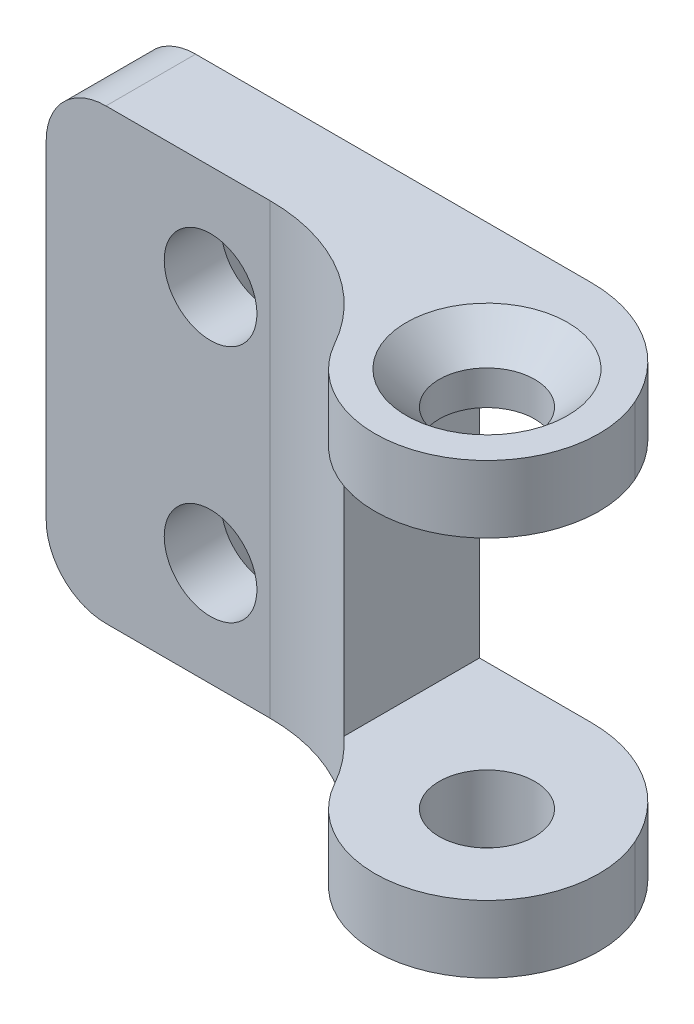
ISO-10303-21;
HEADER;
FILE_DESCRIPTION(('STEP AP214'),'2;1');
FILE_NAME('part.step','',(''),(''),'','','');
FILE_SCHEMA(('AUTOMOTIVE_DESIGN { 1 0 10303 214 1 1 1 1 }'));
ENDSEC;
DATA;
#1=APPLICATION_CONTEXT('core data for automotive mechanical design processes');
#2=APPLICATION_PROTOCOL_DEFINITION('international standard','automotive_design',2000,#1);
#3=PRODUCT_CONTEXT('',#1,'mechanical');
#4=PRODUCT('Part','Part','',(#3));
#5=PRODUCT_RELATED_PRODUCT_CATEGORY('part','',(#4));
#6=PRODUCT_DEFINITION_FORMATION('','',#4);
#7=PRODUCT_DEFINITION_CONTEXT('part definition',#1,'design');
#8=PRODUCT_DEFINITION('design','',#6,#7);
#9=PRODUCT_DEFINITION_SHAPE('','',#8);
#10=(LENGTH_UNIT() NAMED_UNIT(*) SI_UNIT(.MILLI.,.METRE.));
#11=(NAMED_UNIT(*) PLANE_ANGLE_UNIT() SI_UNIT($,.RADIAN.));
#12=(NAMED_UNIT(*) SI_UNIT($,.STERADIAN.) SOLID_ANGLE_UNIT());
#13=UNCERTAINTY_MEASURE_WITH_UNIT(LENGTH_MEASURE(1.E-05),#10,'distance_accuracy_value','');
#14=(GEOMETRIC_REPRESENTATION_CONTEXT(3) GLOBAL_UNCERTAINTY_ASSIGNED_CONTEXT((#13)) GLOBAL_UNIT_ASSIGNED_CONTEXT((#10,
#11,#12)) REPRESENTATION_CONTEXT('',''));
#15=CARTESIAN_POINT('',(0.,0.,0.));
#16=DIRECTION('',(0.,0.,1.));
#17=DIRECTION('',(1.,0.,0.));
#18=AXIS2_PLACEMENT_3D('',#15,#16,#17);
#19=CARTESIAN_POINT('',(0.,30.,0.));
#20=DIRECTION('',(0.,-1.,0.));
#21=DIRECTION('',(0.,0.,-1.));
#22=AXIS2_PLACEMENT_3D('',#19,#20,#21);
#23=CYLINDRICAL_SURFACE('',#22,7.5);
#24=DIRECTION('',(0.,-1.,0.));
#25=VECTOR('',#24,1.);
#26=CARTESIAN_POINT('',(6.85424834992899,30.,-3.04454915504671));
#27=LINE('',#26,#25);
#28=CARTESIAN_POINT('',(6.85424834992899,4.5,-3.04454915504671));
#29=VERTEX_POINT('',#28);
#30=CARTESIAN_POINT('',(6.85424834992899,0.,-3.04454915504671));
#31=VERTEX_POINT('',#30);
#32=EDGE_CURVE('E210',#29,#31,#27,.T.);
#33=ORIENTED_EDGE('',*,*,#32,.F.);
#34=CARTESIAN_POINT('',(0.,4.5,0.));
#35=DIRECTION('',(0.,-1.,0.));
#36=DIRECTION('',(1.,0.,0.));
#37=AXIS2_PLACEMENT_3D('',#34,#35,#36);
#38=CIRCLE('',#37,7.5);
#39=CARTESIAN_POINT('',(-6.54976398689477,4.5,3.65384615384615));
#40=VERTEX_POINT('',#39);
#41=EDGE_CURVE('E156',#29,#40,#38,.T.);
#42=ORIENTED_EDGE('',*,*,#41,.T.);
#43=DIRECTION('',(0.,-1.,0.));
#44=VECTOR('',#43,1.);
#45=CARTESIAN_POINT('',(-6.54976398689477,30.,3.65384615384615));
#46=LINE('',#45,#44);
#47=CARTESIAN_POINT('',(-6.54976398689477,0.,3.65384615384615));
#48=VERTEX_POINT('',#47);
#49=EDGE_CURVE('E214',#40,#48,#46,.T.);
#50=ORIENTED_EDGE('',*,*,#49,.T.);
#51=CARTESIAN_POINT('',(0.,0.,0.));
#52=DIRECTION('',(0.,1.,0.));
#53=DIRECTION('',(0.,0.,1.));
#54=AXIS2_PLACEMENT_3D('',#51,#52,#53);
#55=CIRCLE('',#54,7.5);
#56=EDGE_CURVE('E197',#48,#31,#55,.T.);
#57=ORIENTED_EDGE('',*,*,#56,.T.);
#58=EDGE_LOOP('',(#33,#42,#50,#57));
#59=FACE_BOUND('',#58,.T.);
#60=ADVANCED_FACE('F34',(#59),#23,.T.);
#61=CARTESIAN_POINT('',(-1.53839613283869,30.,0.683331330766514));
#62=DIRECTION('',(0.,-1.,0.));
#63=DIRECTION('',(0.,0.,-1.));
#64=AXIS2_PLACEMENT_3D('',#61,#62,#63);
#65=CYLINDRICAL_SURFACE('',#64,9.18333133076651);
#66=CARTESIAN_POINT('',(6.85424834992899,30.,-3.04454915504671));
#67=VERTEX_POINT('',#66);
#68=CARTESIAN_POINT('',(6.85424834992899,25.5,-3.04454915504671));
#69=VERTEX_POINT('',#68);
#70=EDGE_CURVE('E211',#67,#69,#27,.T.);
#71=ORIENTED_EDGE('',*,*,#70,.T.);
#72=CARTESIAN_POINT('',(-1.53839613283869,25.5,0.683331330766514));
#73=DIRECTION('',(0.,1.,0.));
#74=DIRECTION('',(0.,0.,1.));
#75=AXIS2_PLACEMENT_3D('',#72,#73,#74);
#76=CIRCLE('',#75,9.18333133076651);
#77=CARTESIAN_POINT('',(-1.53839613283869,25.5,-8.5));
#78=VERTEX_POINT('',#77);
#79=EDGE_CURVE('E162',#69,#78,#76,.T.);
#80=ORIENTED_EDGE('',*,*,#79,.T.);
#81=DIRECTION('',(0.,-1.,0.));
#82=VECTOR('',#81,1.);
#83=CARTESIAN_POINT('',(-1.53839613283869,30.,-8.5));
#84=LINE('',#83,#82);
#85=CARTESIAN_POINT('',(-1.53839613283869,30.,-8.5));
#86=VERTEX_POINT('',#85);
#87=EDGE_CURVE('E208',#86,#78,#84,.T.);
#88=ORIENTED_EDGE('',*,*,#87,.F.);
#89=CARTESIAN_POINT('',(-1.53839613283869,30.,0.683331330766514));
#90=DIRECTION('',(0.,1.,0.));
#91=DIRECTION('',(0.,0.,-1.));
#92=AXIS2_PLACEMENT_3D('',#89,#90,#91);
#93=CIRCLE('',#92,9.18333133076651);
#94=EDGE_CURVE('E188',#67,#86,#93,.T.);
#95=ORIENTED_EDGE('',*,*,#94,.F.);
#96=EDGE_LOOP('',(#71,#80,#88,#95));
#97=FACE_BOUND('',#96,.T.);
#98=ADVANCED_FACE('F272',(#97),#65,.T.);
#99=CARTESIAN_POINT('',(0.,30.,0.));
#100=DIRECTION('',(0.,-1.,0.));
#101=DIRECTION('',(0.,0.,-1.));
#102=AXIS2_PLACEMENT_3D('',#99,#100,#101);
#103=CYLINDRICAL_SURFACE('',#102,3.2);
#104=CARTESIAN_POINT('',(0.,27.8,0.));
#105=DIRECTION('',(0.,-1.,0.));
#106=DIRECTION('',(0.,0.,-1.));
#107=AXIS2_PLACEMENT_3D('',#104,#105,#106);
#108=CIRCLE('',#107,3.2);
#109=CARTESIAN_POINT('',(0.,27.8,-3.2));
#110=VERTEX_POINT('',#109);
#111=EDGE_CURVE('E241',#110,#110,#108,.F.);
#112=ORIENTED_EDGE('',*,*,#111,.T.);
#113=EDGE_LOOP('',(#112));
#114=FACE_BOUND('',#113,.T.);
#115=CARTESIAN_POINT('',(0.,25.5,0.));
#116=DIRECTION('',(0.,1.,0.));
#117=DIRECTION('',(0.,0.,1.));
#118=AXIS2_PLACEMENT_3D('',#115,#116,#117);
#119=CIRCLE('',#118,3.2);
#120=CARTESIAN_POINT('',(0.,25.5,3.2));
#121=VERTEX_POINT('',#120);
#122=EDGE_CURVE('E161',#121,#121,#119,.T.);
#123=ORIENTED_EDGE('',*,*,#122,.F.);
#124=EDGE_LOOP('',(#123));
#125=FACE_BOUND('',#124,.T.);
#126=ADVANCED_FACE('F279',(#114,#125),#103,.F.);
#127=CARTESIAN_POINT('',(-1.53839613283869,30.,0.683331330766514));
#128=DIRECTION('',(0.,-1.,0.));
#129=DIRECTION('',(0.,0.,-1.));
#130=AXIS2_PLACEMENT_3D('',#127,#128,#129);
#131=PLANE('',#130);
#132=CARTESIAN_POINT('',(0.,30.,0.));
#133=DIRECTION('',(0.,-1.,0.));
#134=DIRECTION('',(0.,0.,-1.));
#135=AXIS2_PLACEMENT_3D('',#132,#133,#134);
#136=CIRCLE('',#135,5.4);
#137=CARTESIAN_POINT('',(0.,30.,-5.4));
#138=VERTEX_POINT('',#137);
#139=EDGE_CURVE('E248',#138,#138,#136,.T.);
#140=ORIENTED_EDGE('',*,*,#139,.T.);
#141=EDGE_LOOP('',(#140));
#142=FACE_BOUND('',#141,.T.);
#143=DIRECTION('',(-1.,0.,0.));
#144=VECTOR('',#143,1.);
#145=CARTESIAN_POINT('',(-32.,30.,-8.5));
#146=LINE('',#145,#144);
#147=CARTESIAN_POINT('',(-28.,30.,-8.5));
#148=VERTEX_POINT('',#147);
#149=EDGE_CURVE('E190',#86,#148,#146,.T.);
#150=ORIENTED_EDGE('',*,*,#149,.T.);
#151=DIRECTION('',(0.,0.,1.));
#152=VECTOR('',#151,1.);
#153=CARTESIAN_POINT('',(-28.,30.,0.683331330766514));
#154=LINE('',#153,#152);
#155=CARTESIAN_POINT('',(-28.,30.,-2.5));
#156=VERTEX_POINT('',#155);
#157=EDGE_CURVE('E238',#148,#156,#154,.T.);
#158=ORIENTED_EDGE('',*,*,#157,.T.);
#159=DIRECTION('',(1.,0.,0.));
#160=VECTOR('',#159,1.);
#161=CARTESIAN_POINT('',(-17.0293863659264,30.,-2.5));
#162=LINE('',#161,#160);
#163=CARTESIAN_POINT('',(-17.0293863659264,30.,-2.5));
#164=VERTEX_POINT('',#163);
#165=EDGE_CURVE('E181',#156,#164,#162,.T.);
#166=ORIENTED_EDGE('',*,*,#165,.T.);
#167=CARTESIAN_POINT('',(-17.0293863659264,30.,9.5));
#168=DIRECTION('',(0.,-1.,0.));
#169=DIRECTION('',(0.,0.,-1.));
#170=AXIS2_PLACEMENT_3D('',#167,#168,#169);
#171=CIRCLE('',#170,12.);
#172=CARTESIAN_POINT('',(-6.54976398689477,30.,3.65384615384615));
#173=VERTEX_POINT('',#172);
#174=EDGE_CURVE('E183',#164,#173,#171,.T.);
#175=ORIENTED_EDGE('',*,*,#174,.T.);
#176=CARTESIAN_POINT('',(0.,30.,0.));
#177=DIRECTION('',(0.,1.,0.));
#178=DIRECTION('',(0.,0.,1.));
#179=AXIS2_PLACEMENT_3D('',#176,#177,#178);
#180=CIRCLE('',#179,7.5);
#181=EDGE_CURVE('E186',#173,#67,#180,.T.);
#182=ORIENTED_EDGE('',*,*,#181,.T.);
#183=ORIENTED_EDGE('',*,*,#94,.T.);
#184=EDGE_LOOP('',(#150,#158,#166,#175,#182,#183));
#185=FACE_BOUND('',#184,.T.);
#186=ADVANCED_FACE('F304',(#142,#185),#131,.F.);
#187=CARTESIAN_POINT('',(-1.53839613283869,0.,0.683331330766514));
#188=DIRECTION('',(0.,-1.,0.));
#189=DIRECTION('',(0.,0.,-1.));
#190=AXIS2_PLACEMENT_3D('',#187,#188,#189);
#191=PLANE('',#190);
#192=DIRECTION('',(1.,0.,0.));
#193=VECTOR('',#192,1.);
#194=CARTESIAN_POINT('',(-17.0293863659264,0.,-2.5));
#195=LINE('',#194,#193);
#196=CARTESIAN_POINT('',(-28.,0.,-2.5));
#197=VERTEX_POINT('',#196);
#198=CARTESIAN_POINT('',(-17.0293863659264,0.,-2.5));
#199=VERTEX_POINT('',#198);
#200=EDGE_CURVE('E180',#197,#199,#195,.T.);
#201=ORIENTED_EDGE('',*,*,#200,.F.);
#202=DIRECTION('',(0.,0.,1.));
#203=VECTOR('',#202,1.);
#204=CARTESIAN_POINT('',(-28.,0.,-8.5));
#205=LINE('',#204,#203);
#206=CARTESIAN_POINT('',(-28.,0.,-8.5));
#207=VERTEX_POINT('',#206);
#208=EDGE_CURVE('E233',#197,#207,#205,.F.);
#209=ORIENTED_EDGE('',*,*,#208,.T.);
#210=DIRECTION('',(-1.,0.,0.));
#211=VECTOR('',#210,1.);
#212=CARTESIAN_POINT('',(-32.,0.,-8.5));
#213=LINE('',#212,#211);
#214=CARTESIAN_POINT('',(-1.53839613283869,0.,-8.5));
#215=VERTEX_POINT('',#214);
#216=EDGE_CURVE('E184',#215,#207,#213,.T.);
#217=ORIENTED_EDGE('',*,*,#216,.F.);
#218=CARTESIAN_POINT('',(-1.53839613283869,0.,0.683331330766514));
#219=DIRECTION('',(0.,1.,0.));
#220=DIRECTION('',(0.,0.,-1.));
#221=AXIS2_PLACEMENT_3D('',#218,#219,#220);
#222=CIRCLE('',#221,9.18333133076651);
#223=EDGE_CURVE('E200',#31,#215,#222,.T.);
#224=ORIENTED_EDGE('',*,*,#223,.F.);
#225=ORIENTED_EDGE('',*,*,#56,.F.);
#226=CARTESIAN_POINT('',(-17.0293863659264,0.,9.5));
#227=DIRECTION('',(0.,-1.,0.));
#228=DIRECTION('',(0.,0.,-1.));
#229=AXIS2_PLACEMENT_3D('',#226,#227,#228);
#230=CIRCLE('',#229,12.);
#231=EDGE_CURVE('E194',#199,#48,#230,.T.);
#232=ORIENTED_EDGE('',*,*,#231,.F.);
#233=EDGE_LOOP('',(#201,#209,#217,#224,#225,#232));
#234=FACE_BOUND('',#233,.T.);
#235=CARTESIAN_POINT('',(0.,0.,0.));
#236=DIRECTION('',(0.,1.,0.));
#237=DIRECTION('',(0.,0.,1.));
#238=AXIS2_PLACEMENT_3D('',#235,#236,#237);
#239=CIRCLE('',#238,3.2);
#240=CARTESIAN_POINT('',(0.,0.,3.2));
#241=VERTEX_POINT('',#240);
#242=EDGE_CURVE('E177',#241,#241,#239,.T.);
#243=ORIENTED_EDGE('',*,*,#242,.T.);
#244=EDGE_LOOP('',(#243));
#245=FACE_BOUND('',#244,.T.);
#246=ADVANCED_FACE('F369',(#234,#245),#191,.T.);
#247=CARTESIAN_POINT('',(-32.,30.,-2.5));
#248=DIRECTION('',(1.,0.,0.));
#249=DIRECTION('',(0.,0.,-1.));
#250=AXIS2_PLACEMENT_3D('',#247,#248,#249);
#251=PLANE('',#250);
#252=DIRECTION('',(0.,-1.,0.));
#253=VECTOR('',#252,1.);
#254=CARTESIAN_POINT('',(-32.,30.,-8.5));
#255=LINE('',#254,#253);
#256=CARTESIAN_POINT('',(-32.,26.,-8.5));
#257=VERTEX_POINT('',#256);
#258=CARTESIAN_POINT('',(-32.,4.,-8.5));
#259=VERTEX_POINT('',#258);
#260=EDGE_CURVE('E192',#257,#259,#255,.T.);
#261=ORIENTED_EDGE('',*,*,#260,.T.);
#262=DIRECTION('',(0.,0.,1.));
#263=VECTOR('',#262,1.);
#264=CARTESIAN_POINT('',(-32.,4.,-2.5));
#265=LINE('',#264,#263);
#266=CARTESIAN_POINT('',(-32.,4.,-2.5));
#267=VERTEX_POINT('',#266);
#268=EDGE_CURVE('E226',#259,#267,#265,.T.);
#269=ORIENTED_EDGE('',*,*,#268,.T.);
#270=DIRECTION('',(0.,-1.,0.));
#271=VECTOR('',#270,1.);
#272=CARTESIAN_POINT('',(-32.,30.,-2.5));
#273=LINE('',#272,#271);
#274=CARTESIAN_POINT('',(-32.,26.,-2.5));
#275=VERTEX_POINT('',#274);
#276=EDGE_CURVE('E221',#275,#267,#273,.T.);
#277=ORIENTED_EDGE('',*,*,#276,.F.);
#278=DIRECTION('',(0.,0.,1.));
#279=VECTOR('',#278,1.);
#280=CARTESIAN_POINT('',(-32.,26.,-2.5));
#281=LINE('',#280,#279);
#282=EDGE_CURVE('E224',#275,#257,#281,.F.);
#283=ORIENTED_EDGE('',*,*,#282,.T.);
#284=EDGE_LOOP('',(#261,#269,#277,#283));
#285=FACE_BOUND('',#284,.T.);
#286=ADVANCED_FACE('F321',(#285),#251,.F.);
#287=CARTESIAN_POINT('',(-17.0293863659264,30.,-2.5));
#288=DIRECTION('',(0.,0.,-1.));
#289=DIRECTION('',(-1.,0.,0.));
#290=AXIS2_PLACEMENT_3D('',#287,#288,#289);
#291=PLANE('',#290);
#292=CARTESIAN_POINT('',(-21.,7.,-2.5));
#293=DIRECTION('',(0.,0.,-1.));
#294=DIRECTION('',(-1.,0.,0.));
#295=AXIS2_PLACEMENT_3D('',#292,#293,#294);
#296=CIRCLE('',#295,3.1);
#297=CARTESIAN_POINT('',(-24.1,7.,-2.5));
#298=VERTEX_POINT('',#297);
#299=EDGE_CURVE('E171',#298,#298,#296,.T.);
#300=ORIENTED_EDGE('',*,*,#299,.T.);
#301=EDGE_LOOP('',(#300));
#302=FACE_BOUND('',#301,.T.);
#303=CARTESIAN_POINT('',(-21.,23.,-2.5));
#304=DIRECTION('',(0.,0.,-1.));
#305=DIRECTION('',(-1.,0.,0.));
#306=AXIS2_PLACEMENT_3D('',#303,#304,#305);
#307=CIRCLE('',#306,3.1);
#308=CARTESIAN_POINT('',(-24.1,23.,-2.5));
#309=VERTEX_POINT('',#308);
#310=EDGE_CURVE('E174',#309,#309,#307,.T.);
#311=ORIENTED_EDGE('',*,*,#310,.T.);
#312=EDGE_LOOP('',(#311));
#313=FACE_BOUND('',#312,.T.);
#314=ORIENTED_EDGE('',*,*,#276,.T.);
#315=CARTESIAN_POINT('',(-28.,4.,-2.5));
#316=DIRECTION('',(0.,0.,-1.));
#317=DIRECTION('',(-1.,0.,0.));
#318=AXIS2_PLACEMENT_3D('',#315,#316,#317);
#319=CIRCLE('',#318,4.);
#320=EDGE_CURVE('E231',#267,#197,#319,.F.);
#321=ORIENTED_EDGE('',*,*,#320,.T.);
#322=ORIENTED_EDGE('',*,*,#200,.T.);
#323=DIRECTION('',(0.,-1.,0.));
#324=VECTOR('',#323,1.);
#325=CARTESIAN_POINT('',(-17.0293863659264,30.,-2.5));
#326=LINE('',#325,#324);
#327=EDGE_CURVE('E218',#164,#199,#326,.T.);
#328=ORIENTED_EDGE('',*,*,#327,.F.);
#329=ORIENTED_EDGE('',*,*,#165,.F.);
#330=CARTESIAN_POINT('',(-28.,26.,-2.5));
#331=DIRECTION('',(0.,0.,-1.));
#332=DIRECTION('',(-1.,0.,0.));
#333=AXIS2_PLACEMENT_3D('',#330,#331,#332);
#334=CIRCLE('',#333,4.);
#335=EDGE_CURVE('E229',#156,#275,#334,.F.);
#336=ORIENTED_EDGE('',*,*,#335,.T.);
#337=EDGE_LOOP('',(#314,#321,#322,#328,#329,#336));
#338=FACE_BOUND('',#337,.T.);
#339=ADVANCED_FACE('F293',(#302,#313,#338),#291,.F.);
#340=CARTESIAN_POINT('',(-17.0293863659264,30.,9.5));
#341=DIRECTION('',(0.,-1.,0.));
#342=DIRECTION('',(0.,0.,-1.));
#343=AXIS2_PLACEMENT_3D('',#340,#341,#342);
#344=CYLINDRICAL_SURFACE('',#343,12.);
#345=DIRECTION('',(0.,-1.,0.));
#346=VECTOR('',#345,1.);
#347=CARTESIAN_POINT('',(-9.,30.,0.582099205156228));
#348=LINE('',#347,#346);
#349=CARTESIAN_POINT('',(-9.,4.5,0.582099205156224));
#350=VERTEX_POINT('',#349);
#351=CARTESIAN_POINT('',(-9.,25.5,0.582099205156228));
#352=VERTEX_POINT('',#351);
#353=EDGE_CURVE('E139',#350,#352,#348,.F.);
#354=ORIENTED_EDGE('',*,*,#353,.T.);
#355=CARTESIAN_POINT('',(-17.0293863659264,25.5,9.5));
#356=DIRECTION('',(0.,1.,0.));
#357=DIRECTION('',(0.,0.,1.));
#358=AXIS2_PLACEMENT_3D('',#355,#356,#357);
#359=CIRCLE('',#358,12.);
#360=CARTESIAN_POINT('',(-6.54976398689477,25.5,3.65384615384615));
#361=VERTEX_POINT('',#360);
#362=EDGE_CURVE('E167',#352,#361,#359,.F.);
#363=ORIENTED_EDGE('',*,*,#362,.T.);
#364=EDGE_CURVE('E215',#173,#361,#46,.T.);
#365=ORIENTED_EDGE('',*,*,#364,.F.);
#366=ORIENTED_EDGE('',*,*,#174,.F.);
#367=ORIENTED_EDGE('',*,*,#327,.T.);
#368=ORIENTED_EDGE('',*,*,#231,.T.);
#369=ORIENTED_EDGE('',*,*,#49,.F.);
#370=CARTESIAN_POINT('',(-17.0293863659264,4.5,9.5));
#371=DIRECTION('',(0.,-1.,0.));
#372=DIRECTION('',(1.,0.,0.));
#373=AXIS2_PLACEMENT_3D('',#370,#371,#372);
#374=CIRCLE('',#373,12.);
#375=EDGE_CURVE('E159',#40,#350,#374,.F.);
#376=ORIENTED_EDGE('',*,*,#375,.T.);
#377=EDGE_LOOP('',(#354,#363,#365,#366,#367,#368,#369,#376));
#378=FACE_BOUND('',#377,.T.);
#379=ADVANCED_FACE('F286',(#378),#344,.F.);
#380=CARTESIAN_POINT('',(0.,25.5,0.));
#381=DIRECTION('',(0.,1.,0.));
#382=DIRECTION('',(0.,0.,1.));
#383=AXIS2_PLACEMENT_3D('',#380,#381,#382);
#384=CIRCLE('',#383,7.5);
#385=EDGE_CURVE('E165',#361,#69,#384,.T.);
#386=ORIENTED_EDGE('',*,*,#385,.T.);
#387=ORIENTED_EDGE('',*,*,#70,.F.);
#388=ORIENTED_EDGE('',*,*,#181,.F.);
#389=ORIENTED_EDGE('',*,*,#364,.T.);
#390=EDGE_LOOP('',(#386,#387,#388,#389));
#391=FACE_BOUND('',#390,.T.);
#392=ADVANCED_FACE('F275',(#391),#23,.T.);
#393=CARTESIAN_POINT('',(-1.53839613283869,4.5,-8.5));
#394=VERTEX_POINT('',#393);
#395=EDGE_CURVE('E207',#394,#215,#84,.T.);
#396=ORIENTED_EDGE('',*,*,#395,.F.);
#397=CARTESIAN_POINT('',(-1.53839613283869,4.5,0.683331330766514));
#398=DIRECTION('',(0.,-1.,0.));
#399=DIRECTION('',(1.,0.,0.));
#400=AXIS2_PLACEMENT_3D('',#397,#398,#399);
#401=CIRCLE('',#400,9.18333133076651);
#402=EDGE_CURVE('E49',#394,#29,#401,.T.);
#403=ORIENTED_EDGE('',*,*,#402,.T.);
#404=ORIENTED_EDGE('',*,*,#32,.T.);
#405=ORIENTED_EDGE('',*,*,#223,.T.);
#406=EDGE_LOOP('',(#396,#403,#404,#405));
#407=FACE_BOUND('',#406,.T.);
#408=ADVANCED_FACE('F282',(#407),#65,.T.);
#409=CARTESIAN_POINT('',(-32.,30.,-8.5));
#410=DIRECTION('',(0.,0.,1.));
#411=DIRECTION('',(1.,0.,0.));
#412=AXIS2_PLACEMENT_3D('',#409,#410,#411);
#413=PLANE('',#412);
#414=CARTESIAN_POINT('',(-21.,7.,-8.5));
#415=DIRECTION('',(0.,0.,1.));
#416=DIRECTION('',(1.,0.,0.));
#417=AXIS2_PLACEMENT_3D('',#414,#415,#416);
#418=CIRCLE('',#417,5.30000000000002);
#419=CARTESIAN_POINT('',(-15.7,7.,-8.5));
#420=VERTEX_POINT('',#419);
#421=EDGE_CURVE('E11',#420,#420,#418,.T.);
#422=ORIENTED_EDGE('',*,*,#421,.T.);
#423=EDGE_LOOP('',(#422));
#424=FACE_BOUND('',#423,.T.);
#425=CARTESIAN_POINT('',(-21.,23.,-8.5));
#426=DIRECTION('',(0.,0.,1.));
#427=DIRECTION('',(1.,0.,0.));
#428=AXIS2_PLACEMENT_3D('',#425,#426,#427);
#429=CIRCLE('',#428,5.30000000000002);
#430=CARTESIAN_POINT('',(-15.7,23.,-8.5));
#431=VERTEX_POINT('',#430);
#432=EDGE_CURVE('E254',#431,#431,#429,.T.);
#433=ORIENTED_EDGE('',*,*,#432,.T.);
#434=EDGE_LOOP('',(#433));
#435=FACE_BOUND('',#434,.T.);
#436=ORIENTED_EDGE('',*,*,#87,.T.);
#437=DIRECTION('',(1.,0.,0.));
#438=VECTOR('',#437,1.);
#439=CARTESIAN_POINT('',(13.4629251052489,25.5,-8.5));
#440=LINE('',#439,#438);
#441=CARTESIAN_POINT('',(-9.,25.5,-8.5));
#442=VERTEX_POINT('',#441);
#443=EDGE_CURVE('E146',#442,#78,#440,.T.);
#444=ORIENTED_EDGE('',*,*,#443,.F.);
#445=DIRECTION('',(0.,1.,0.));
#446=VECTOR('',#445,1.);
#447=CARTESIAN_POINT('',(-9.,25.5,-8.5));
#448=LINE('',#447,#446);
#449=CARTESIAN_POINT('',(-9.,4.5,-8.5));
#450=VERTEX_POINT('',#449);
#451=EDGE_CURVE('E136',#450,#442,#448,.T.);
#452=ORIENTED_EDGE('',*,*,#451,.F.);
#453=DIRECTION('',(-1.,0.,0.));
#454=VECTOR('',#453,1.);
#455=CARTESIAN_POINT('',(-9.,4.5,-8.5));
#456=LINE('',#455,#454);
#457=EDGE_CURVE('E143',#394,#450,#456,.T.);
#458=ORIENTED_EDGE('',*,*,#457,.F.);
#459=ORIENTED_EDGE('',*,*,#395,.T.);
#460=ORIENTED_EDGE('',*,*,#216,.T.);
#461=CARTESIAN_POINT('',(-28.,4.,-8.5));
#462=DIRECTION('',(0.,0.,1.));
#463=DIRECTION('',(1.,0.,0.));
#464=AXIS2_PLACEMENT_3D('',#461,#462,#463);
#465=CIRCLE('',#464,4.);
#466=EDGE_CURVE('E236',#207,#259,#465,.F.);
#467=ORIENTED_EDGE('',*,*,#466,.T.);
#468=ORIENTED_EDGE('',*,*,#260,.F.);
#469=CARTESIAN_POINT('',(-28.,26.,-8.5));
#470=DIRECTION('',(0.,0.,1.));
#471=DIRECTION('',(1.,0.,0.));
#472=AXIS2_PLACEMENT_3D('',#469,#470,#471);
#473=CIRCLE('',#472,4.);
#474=EDGE_CURVE('E57',#257,#148,#473,.F.);
#475=ORIENTED_EDGE('',*,*,#474,.T.);
#476=ORIENTED_EDGE('',*,*,#149,.F.);
#477=EDGE_LOOP('',(#436,#444,#452,#458,#459,#460,#467,#468,#475,#476));
#478=FACE_BOUND('',#477,.T.);
#479=ADVANCED_FACE('F149',(#424,#435,#478),#413,.F.);
#480=CARTESIAN_POINT('',(0.,4.5,0.));
#481=DIRECTION('',(0.,-1.,0.));
#482=DIRECTION('',(1.,0.,0.));
#483=AXIS2_PLACEMENT_3D('',#480,#481,#482);
#484=CIRCLE('',#483,3.2);
#485=CARTESIAN_POINT('',(3.2,4.5,0.));
#486=VERTEX_POINT('',#485);
#487=EDGE_CURVE('E153',#486,#486,#484,.T.);
#488=ORIENTED_EDGE('',*,*,#487,.F.);
#489=EDGE_LOOP('',(#488));
#490=FACE_BOUND('',#489,.T.);
#491=ORIENTED_EDGE('',*,*,#242,.F.);
#492=EDGE_LOOP('',(#491));
#493=FACE_BOUND('',#492,.T.);
#494=ADVANCED_FACE('F336',(#490,#493),#103,.F.);
#495=CARTESIAN_POINT('',(-28.,4.,-2.5));
#496=DIRECTION('',(0.,0.,-1.));
#497=DIRECTION('',(-1.,0.,0.));
#498=AXIS2_PLACEMENT_3D('',#495,#496,#497);
#499=CYLINDRICAL_SURFACE('',#498,4.);
#500=ORIENTED_EDGE('',*,*,#466,.F.);
#501=ORIENTED_EDGE('',*,*,#208,.F.);
#502=ORIENTED_EDGE('',*,*,#320,.F.);
#503=ORIENTED_EDGE('',*,*,#268,.F.);
#504=EDGE_LOOP('',(#500,#501,#502,#503));
#505=FACE_BOUND('',#504,.T.);
#506=ADVANCED_FACE('F318',(#505),#499,.T.);
#507=CARTESIAN_POINT('',(-28.,26.,0.683331330766514));
#508=DIRECTION('',(0.,0.,1.));
#509=DIRECTION('',(1.,0.,0.));
#510=AXIS2_PLACEMENT_3D('',#507,#508,#509);
#511=CYLINDRICAL_SURFACE('',#510,4.);
#512=ORIENTED_EDGE('',*,*,#474,.F.);
#513=ORIENTED_EDGE('',*,*,#282,.F.);
#514=ORIENTED_EDGE('',*,*,#335,.F.);
#515=ORIENTED_EDGE('',*,*,#157,.F.);
#516=EDGE_LOOP('',(#512,#513,#514,#515));
#517=FACE_BOUND('',#516,.T.);
#518=ADVANCED_FACE('F326',(#517),#511,.T.);
#519=CARTESIAN_POINT('',(-21.,23.,7.50000000000001));
#520=DIRECTION('',(0.,0.,-1.));
#521=DIRECTION('',(-1.,0.,0.));
#522=AXIS2_PLACEMENT_3D('',#519,#520,#521);
#523=CYLINDRICAL_SURFACE('',#522,3.1);
#524=CARTESIAN_POINT('',(-21.,23.,-6.3));
#525=DIRECTION('',(0.,0.,1.));
#526=DIRECTION('',(1.,0.,0.));
#527=AXIS2_PLACEMENT_3D('',#524,#525,#526);
#528=CIRCLE('',#527,3.1);
#529=CARTESIAN_POINT('',(-17.9,23.,-6.3));
#530=VERTEX_POINT('',#529);
#531=EDGE_CURVE('E251',#530,#530,#528,.F.);
#532=ORIENTED_EDGE('',*,*,#531,.T.);
#533=EDGE_LOOP('',(#532));
#534=FACE_BOUND('',#533,.T.);
#535=ORIENTED_EDGE('',*,*,#310,.F.);
#536=EDGE_LOOP('',(#535));
#537=FACE_BOUND('',#536,.T.);
#538=ADVANCED_FACE('F328',(#534,#537),#523,.F.);
#539=CARTESIAN_POINT('',(-21.,7.,7.50000000000001));
#540=DIRECTION('',(0.,0.,-1.));
#541=DIRECTION('',(-1.,0.,0.));
#542=AXIS2_PLACEMENT_3D('',#539,#540,#541);
#543=CYLINDRICAL_SURFACE('',#542,3.1);
#544=CARTESIAN_POINT('',(-21.,7.,-6.3));
#545=DIRECTION('',(0.,0.,1.));
#546=DIRECTION('',(1.,0.,0.));
#547=AXIS2_PLACEMENT_3D('',#544,#545,#546);
#548=CIRCLE('',#547,3.1);
#549=CARTESIAN_POINT('',(-17.9,7.,-6.3));
#550=VERTEX_POINT('',#549);
#551=EDGE_CURVE('E42',#550,#550,#548,.F.);
#552=ORIENTED_EDGE('',*,*,#551,.T.);
#553=EDGE_LOOP('',(#552));
#554=FACE_BOUND('',#553,.T.);
#555=ORIENTED_EDGE('',*,*,#299,.F.);
#556=EDGE_LOOP('',(#555));
#557=FACE_BOUND('',#556,.T.);
#558=ADVANCED_FACE('F259',(#554,#557),#543,.F.);
#559=CARTESIAN_POINT('',(-9.,25.5,7.5));
#560=DIRECTION('',(-1.,0.,0.));
#561=DIRECTION('',(0.,-1.,0.));
#562=AXIS2_PLACEMENT_3D('',#559,#560,#561);
#563=PLANE('',#562);
#564=DIRECTION('',(0.,0.,-1.));
#565=VECTOR('',#564,1.);
#566=CARTESIAN_POINT('',(-9.,4.5,7.5));
#567=LINE('',#566,#565);
#568=EDGE_CURVE('E132',#350,#450,#567,.T.);
#569=ORIENTED_EDGE('',*,*,#568,.T.);
#570=ORIENTED_EDGE('',*,*,#451,.T.);
#571=DIRECTION('',(0.,0.,-1.));
#572=VECTOR('',#571,1.);
#573=CARTESIAN_POINT('',(-9.,25.5,7.5));
#574=LINE('',#573,#572);
#575=EDGE_CURVE('E141',#352,#442,#574,.T.);
#576=ORIENTED_EDGE('',*,*,#575,.F.);
#577=ORIENTED_EDGE('',*,*,#353,.F.);
#578=EDGE_LOOP('',(#569,#570,#576,#577));
#579=FACE_BOUND('',#578,.T.);
#580=ADVANCED_FACE('F133',(#579),#563,.F.);
#581=CARTESIAN_POINT('',(13.4629251052489,25.5,7.5));
#582=DIRECTION('',(0.,1.,0.));
#583=DIRECTION('',(0.,0.,1.));
#584=AXIS2_PLACEMENT_3D('',#581,#582,#583);
#585=PLANE('',#584);
#586=ORIENTED_EDGE('',*,*,#122,.T.);
#587=EDGE_LOOP('',(#586));
#588=FACE_BOUND('',#587,.T.);
#589=ORIENTED_EDGE('',*,*,#575,.T.);
#590=ORIENTED_EDGE('',*,*,#443,.T.);
#591=ORIENTED_EDGE('',*,*,#79,.F.);
#592=ORIENTED_EDGE('',*,*,#385,.F.);
#593=ORIENTED_EDGE('',*,*,#362,.F.);
#594=EDGE_LOOP('',(#589,#590,#591,#592,#593));
#595=FACE_BOUND('',#594,.T.);
#596=ADVANCED_FACE('F301',(#588,#595),#585,.F.);
#597=CARTESIAN_POINT('',(-9.,4.5,7.5));
#598=DIRECTION('',(0.,-1.,0.));
#599=DIRECTION('',(1.,0.,0.));
#600=AXIS2_PLACEMENT_3D('',#597,#598,#599);
#601=PLANE('',#600);
#602=ORIENTED_EDGE('',*,*,#487,.T.);
#603=EDGE_LOOP('',(#602));
#604=FACE_BOUND('',#603,.T.);
#605=ORIENTED_EDGE('',*,*,#41,.F.);
#606=ORIENTED_EDGE('',*,*,#402,.F.);
#607=ORIENTED_EDGE('',*,*,#457,.T.);
#608=ORIENTED_EDGE('',*,*,#568,.F.);
#609=ORIENTED_EDGE('',*,*,#375,.F.);
#610=EDGE_LOOP('',(#605,#606,#607,#608,#609));
#611=FACE_BOUND('',#610,.T.);
#612=ADVANCED_FACE('F144',(#604,#611),#601,.F.);
#613=CARTESIAN_POINT('',(0.,27.8,0.));
#614=DIRECTION('',(0.,1.,0.));
#615=DIRECTION('',(0.,0.,1.));
#616=AXIS2_PLACEMENT_3D('',#613,#614,#615);
#617=CONICAL_SURFACE('',#616,3.2,0.785398163397449);
#618=ORIENTED_EDGE('',*,*,#139,.F.);
#619=EDGE_LOOP('',(#618));
#620=FACE_BOUND('',#619,.T.);
#621=ORIENTED_EDGE('',*,*,#111,.F.);
#622=EDGE_LOOP('',(#621));
#623=FACE_BOUND('',#622,.T.);
#624=ADVANCED_FACE('F268',(#620,#623),#617,.F.);
#625=CARTESIAN_POINT('',(-21.,23.,-6.3));
#626=DIRECTION('',(0.,0.,-1.));
#627=DIRECTION('',(-1.,0.,0.));
#628=AXIS2_PLACEMENT_3D('',#625,#626,#627);
#629=CONICAL_SURFACE('',#628,3.1,0.785398163397451);
#630=ORIENTED_EDGE('',*,*,#432,.F.);
#631=EDGE_LOOP('',(#630));
#632=FACE_BOUND('',#631,.T.);
#633=ORIENTED_EDGE('',*,*,#531,.F.);
#634=EDGE_LOOP('',(#633));
#635=FACE_BOUND('',#634,.T.);
#636=ADVANCED_FACE('F263',(#632,#635),#629,.F.);
#637=CARTESIAN_POINT('',(-21.,7.,-6.3));
#638=DIRECTION('',(0.,0.,-1.));
#639=DIRECTION('',(-1.,0.,0.));
#640=AXIS2_PLACEMENT_3D('',#637,#638,#639);
#641=CONICAL_SURFACE('',#640,3.1,0.785398163397451);
#642=ORIENTED_EDGE('',*,*,#421,.F.);
#643=EDGE_LOOP('',(#642));
#644=FACE_BOUND('',#643,.T.);
#645=ORIENTED_EDGE('',*,*,#551,.F.);
#646=EDGE_LOOP('',(#645));
#647=FACE_BOUND('',#646,.T.);
#648=ADVANCED_FACE('F36',(#644,#647),#641,.F.);
#649=CLOSED_SHELL('',(#60,#98,#126,#186,#246,#286,#339,#379,#392,#408,#479,#494,#506,#518,#538,
#558,#580,#596,#612,#624,#636,#648));
#650=MANIFOLD_SOLID_BREP('B2',#649);
#651=ADVANCED_BREP_SHAPE_REPRESENTATION('',(#18,#650),#14);
#652=SHAPE_DEFINITION_REPRESENTATION(#9,#651);
ENDSEC;
END-ISO-10303-21;
